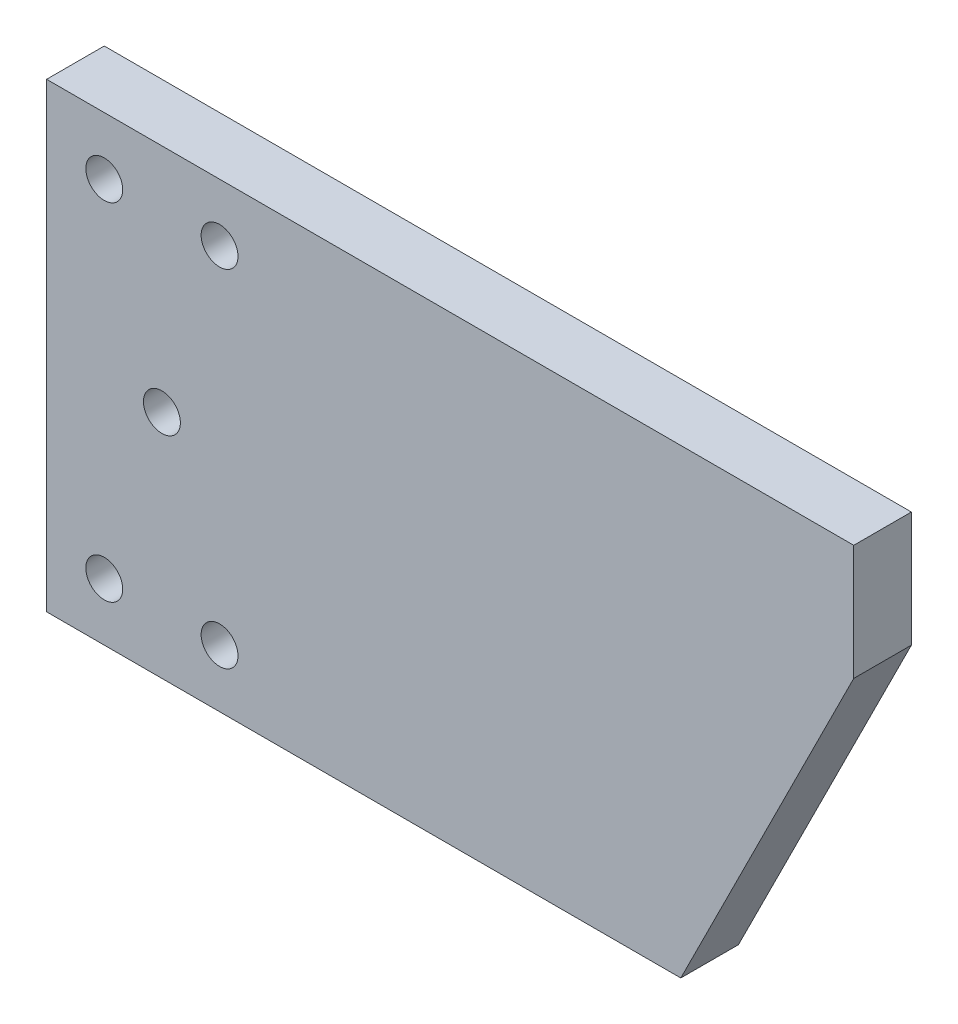
ISO-10303-21;
HEADER;
FILE_DESCRIPTION(('STEP AP214'),'2;1');
FILE_NAME('part.step','',(''),(''),'','','');
FILE_SCHEMA(('AUTOMOTIVE_DESIGN { 1 0 10303 214 1 1 1 1 }'));
ENDSEC;
DATA;
#1=APPLICATION_CONTEXT('core data for automotive mechanical design processes');
#2=APPLICATION_PROTOCOL_DEFINITION('international standard','automotive_design',2000,#1);
#3=PRODUCT_CONTEXT('',#1,'mechanical');
#4=PRODUCT('Part','Part','',(#3));
#5=PRODUCT_RELATED_PRODUCT_CATEGORY('part','',(#4));
#6=PRODUCT_DEFINITION_FORMATION('','',#4);
#7=PRODUCT_DEFINITION_CONTEXT('part definition',#1,'design');
#8=PRODUCT_DEFINITION('design','',#6,#7);
#9=PRODUCT_DEFINITION_SHAPE('','',#8);
#10=(LENGTH_UNIT() NAMED_UNIT(*) SI_UNIT(.MILLI.,.METRE.));
#11=(NAMED_UNIT(*) PLANE_ANGLE_UNIT() SI_UNIT($,.RADIAN.));
#12=(NAMED_UNIT(*) SI_UNIT($,.STERADIAN.) SOLID_ANGLE_UNIT());
#13=UNCERTAINTY_MEASURE_WITH_UNIT(LENGTH_MEASURE(1.E-05),#10,'distance_accuracy_value','');
#14=(GEOMETRIC_REPRESENTATION_CONTEXT(3) GLOBAL_UNCERTAINTY_ASSIGNED_CONTEXT((#13)) GLOBAL_UNIT_ASSIGNED_CONTEXT((#10,
#11,#12)) REPRESENTATION_CONTEXT('',''));
#15=CARTESIAN_POINT('',(0.,0.,0.));
#16=DIRECTION('',(0.,0.,1.));
#17=DIRECTION('',(1.,0.,0.));
#18=AXIS2_PLACEMENT_3D('',#15,#16,#17);
#19=CARTESIAN_POINT('',(0.,0.,6.35));
#20=DIRECTION('',(0.,0.,-1.));
#21=DIRECTION('',(-1.,0.,0.));
#22=AXIS2_PLACEMENT_3D('',#19,#20,#21);
#23=PLANE('',#22);
#24=DIRECTION('',(0.,-1.,0.));
#25=VECTOR('',#24,1.);
#26=CARTESIAN_POINT('',(0.,0.,6.35));
#27=LINE('',#26,#25);
#28=CARTESIAN_POINT('',(0.,50.8,6.35));
#29=VERTEX_POINT('',#28);
#30=CARTESIAN_POINT('',(0.,0.,6.35));
#31=VERTEX_POINT('',#30);
#32=EDGE_CURVE('E119',#29,#31,#27,.T.);
#33=ORIENTED_EDGE('',*,*,#32,.T.);
#34=DIRECTION('',(1.,0.,0.));
#35=VECTOR('',#34,1.);
#36=CARTESIAN_POINT('',(0.,0.,6.35));
#37=LINE('',#36,#35);
#38=CARTESIAN_POINT('',(69.85,0.,6.35));
#39=VERTEX_POINT('',#38);
#40=EDGE_CURVE('E86',#31,#39,#37,.T.);
#41=ORIENTED_EDGE('',*,*,#40,.T.);
#42=DIRECTION('',(0.447213595499958,0.894427190999916,0.));
#43=VECTOR('',#42,1.);
#44=CARTESIAN_POINT('',(69.85,0.,6.35));
#45=LINE('',#44,#43);
#46=CARTESIAN_POINT('',(88.9,38.1,6.35));
#47=VERTEX_POINT('',#46);
#48=EDGE_CURVE('E90',#39,#47,#45,.T.);
#49=ORIENTED_EDGE('',*,*,#48,.T.);
#50=DIRECTION('',(0.,1.,0.));
#51=VECTOR('',#50,1.);
#52=CARTESIAN_POINT('',(88.9,38.1,6.35));
#53=LINE('',#52,#51);
#54=CARTESIAN_POINT('',(88.9,50.8,6.35));
#55=VERTEX_POINT('',#54);
#56=EDGE_CURVE('E94',#47,#55,#53,.T.);
#57=ORIENTED_EDGE('',*,*,#56,.T.);
#58=DIRECTION('',(-1.,0.,0.));
#59=VECTOR('',#58,1.);
#60=CARTESIAN_POINT('',(0.,50.8,6.35));
#61=LINE('',#60,#59);
#62=EDGE_CURVE('E52',#55,#29,#61,.T.);
#63=ORIENTED_EDGE('',*,*,#62,.T.);
#64=EDGE_LOOP('',(#33,#41,#49,#57,#63));
#65=FACE_BOUND('',#64,.T.);
#66=CARTESIAN_POINT('',(6.35,6.35,6.35));
#67=DIRECTION('',(0.,0.,1.));
#68=DIRECTION('',(1.,0.,0.));
#69=AXIS2_PLACEMENT_3D('',#66,#67,#68);
#70=CIRCLE('',#69,2.032);
#71=CARTESIAN_POINT('',(8.382,6.35,6.35));
#72=VERTEX_POINT('',#71);
#73=EDGE_CURVE('E114',#72,#72,#70,.T.);
#74=ORIENTED_EDGE('',*,*,#73,.F.);
#75=EDGE_LOOP('',(#74));
#76=FACE_BOUND('',#75,.T.);
#77=CARTESIAN_POINT('',(12.7,25.4,6.35));
#78=DIRECTION('',(0.,0.,1.));
#79=DIRECTION('',(1.,0.,0.));
#80=AXIS2_PLACEMENT_3D('',#77,#78,#79);
#81=CIRCLE('',#80,2.032);
#82=CARTESIAN_POINT('',(14.732,25.4,6.35));
#83=VERTEX_POINT('',#82);
#84=EDGE_CURVE('E188',#83,#83,#81,.T.);
#85=ORIENTED_EDGE('',*,*,#84,.F.);
#86=EDGE_LOOP('',(#85));
#87=FACE_BOUND('',#86,.T.);
#88=CARTESIAN_POINT('',(19.05,6.35,6.35));
#89=DIRECTION('',(0.,0.,1.));
#90=DIRECTION('',(1.,0.,0.));
#91=AXIS2_PLACEMENT_3D('',#88,#89,#90);
#92=CIRCLE('',#91,2.032);
#93=CARTESIAN_POINT('',(21.082,6.35,6.35));
#94=VERTEX_POINT('',#93);
#95=EDGE_CURVE('E182',#94,#94,#92,.T.);
#96=ORIENTED_EDGE('',*,*,#95,.F.);
#97=EDGE_LOOP('',(#96));
#98=FACE_BOUND('',#97,.T.);
#99=CARTESIAN_POINT('',(19.0499999999999,44.45,6.35));
#100=DIRECTION('',(0.,0.,1.));
#101=DIRECTION('',(1.,0.,0.));
#102=AXIS2_PLACEMENT_3D('',#99,#100,#101);
#103=CIRCLE('',#102,2.032);
#104=CARTESIAN_POINT('',(21.0819999999999,44.45,6.35));
#105=VERTEX_POINT('',#104);
#106=EDGE_CURVE('E176',#105,#105,#103,.T.);
#107=ORIENTED_EDGE('',*,*,#106,.F.);
#108=EDGE_LOOP('',(#107));
#109=FACE_BOUND('',#108,.T.);
#110=CARTESIAN_POINT('',(6.34999999999987,44.45,6.35));
#111=DIRECTION('',(0.,0.,1.));
#112=DIRECTION('',(1.,0.,0.));
#113=AXIS2_PLACEMENT_3D('',#110,#111,#112);
#114=CIRCLE('',#113,2.032);
#115=CARTESIAN_POINT('',(8.38199999999987,44.45,6.35));
#116=VERTEX_POINT('',#115);
#117=EDGE_CURVE('E167',#116,#116,#114,.T.);
#118=ORIENTED_EDGE('',*,*,#117,.F.);
#119=EDGE_LOOP('',(#118));
#120=FACE_BOUND('',#119,.T.);
#121=ADVANCED_FACE('F35',(#65,#76,#87,#98,#109,#120),#23,.F.);
#122=CARTESIAN_POINT('',(0.,0.,0.));
#123=DIRECTION('',(0.,0.,-1.));
#124=DIRECTION('',(-1.,0.,0.));
#125=AXIS2_PLACEMENT_3D('',#122,#123,#124);
#126=PLANE('',#125);
#127=CARTESIAN_POINT('',(19.0499999999999,44.45,0.));
#128=DIRECTION('',(0.,0.,1.));
#129=DIRECTION('',(1.,0.,0.));
#130=AXIS2_PLACEMENT_3D('',#127,#128,#129);
#131=CIRCLE('',#130,2.032);
#132=CARTESIAN_POINT('',(21.0819999999999,44.45,0.));
#133=VERTEX_POINT('',#132);
#134=EDGE_CURVE('E173',#133,#133,#131,.T.);
#135=ORIENTED_EDGE('',*,*,#134,.T.);
#136=EDGE_LOOP('',(#135));
#137=FACE_BOUND('',#136,.T.);
#138=CARTESIAN_POINT('',(12.7,25.4,0.));
#139=DIRECTION('',(0.,0.,1.));
#140=DIRECTION('',(1.,0.,0.));
#141=AXIS2_PLACEMENT_3D('',#138,#139,#140);
#142=CIRCLE('',#141,2.032);
#143=CARTESIAN_POINT('',(14.732,25.4,0.));
#144=VERTEX_POINT('',#143);
#145=EDGE_CURVE('E185',#144,#144,#142,.T.);
#146=ORIENTED_EDGE('',*,*,#145,.T.);
#147=EDGE_LOOP('',(#146));
#148=FACE_BOUND('',#147,.T.);
#149=DIRECTION('',(0.,-1.,0.));
#150=VECTOR('',#149,1.);
#151=CARTESIAN_POINT('',(0.,0.,0.));
#152=LINE('',#151,#150);
#153=CARTESIAN_POINT('',(0.,50.8,0.));
#154=VERTEX_POINT('',#153);
#155=CARTESIAN_POINT('',(0.,0.,0.));
#156=VERTEX_POINT('',#155);
#157=EDGE_CURVE('E110',#154,#156,#152,.T.);
#158=ORIENTED_EDGE('',*,*,#157,.F.);
#159=DIRECTION('',(-1.,0.,0.));
#160=VECTOR('',#159,1.);
#161=CARTESIAN_POINT('',(0.,50.8,0.));
#162=LINE('',#161,#160);
#163=CARTESIAN_POINT('',(88.9,50.8,0.));
#164=VERTEX_POINT('',#163);
#165=EDGE_CURVE('E78',#164,#154,#162,.T.);
#166=ORIENTED_EDGE('',*,*,#165,.F.);
#167=DIRECTION('',(0.,1.,0.));
#168=VECTOR('',#167,1.);
#169=CARTESIAN_POINT('',(88.9,38.1,0.));
#170=LINE('',#169,#168);
#171=CARTESIAN_POINT('',(88.9,38.1,0.));
#172=VERTEX_POINT('',#171);
#173=EDGE_CURVE('E72',#172,#164,#170,.T.);
#174=ORIENTED_EDGE('',*,*,#173,.F.);
#175=DIRECTION('',(0.447213595499958,0.894427190999916,0.));
#176=VECTOR('',#175,1.);
#177=CARTESIAN_POINT('',(69.85,0.,0.));
#178=LINE('',#177,#176);
#179=CARTESIAN_POINT('',(69.85,0.,0.));
#180=VERTEX_POINT('',#179);
#181=EDGE_CURVE('E101',#180,#172,#178,.T.);
#182=ORIENTED_EDGE('',*,*,#181,.F.);
#183=DIRECTION('',(1.,0.,0.));
#184=VECTOR('',#183,1.);
#185=CARTESIAN_POINT('',(0.,0.,0.));
#186=LINE('',#185,#184);
#187=EDGE_CURVE('E113',#156,#180,#186,.T.);
#188=ORIENTED_EDGE('',*,*,#187,.F.);
#189=EDGE_LOOP('',(#158,#166,#174,#182,#188));
#190=FACE_BOUND('',#189,.T.);
#191=CARTESIAN_POINT('',(6.35,6.35,0.));
#192=DIRECTION('',(0.,0.,1.));
#193=DIRECTION('',(1.,0.,0.));
#194=AXIS2_PLACEMENT_3D('',#191,#192,#193);
#195=CIRCLE('',#194,2.032);
#196=CARTESIAN_POINT('',(8.382,6.35,0.));
#197=VERTEX_POINT('',#196);
#198=EDGE_CURVE('E191',#197,#197,#195,.T.);
#199=ORIENTED_EDGE('',*,*,#198,.T.);
#200=EDGE_LOOP('',(#199));
#201=FACE_BOUND('',#200,.T.);
#202=CARTESIAN_POINT('',(19.05,6.35,0.));
#203=DIRECTION('',(0.,0.,1.));
#204=DIRECTION('',(1.,0.,0.));
#205=AXIS2_PLACEMENT_3D('',#202,#203,#204);
#206=CIRCLE('',#205,2.032);
#207=CARTESIAN_POINT('',(21.082,6.35,0.));
#208=VERTEX_POINT('',#207);
#209=EDGE_CURVE('E179',#208,#208,#206,.T.);
#210=ORIENTED_EDGE('',*,*,#209,.T.);
#211=EDGE_LOOP('',(#210));
#212=FACE_BOUND('',#211,.T.);
#213=CARTESIAN_POINT('',(6.34999999999987,44.45,0.));
#214=DIRECTION('',(0.,0.,1.));
#215=DIRECTION('',(1.,0.,0.));
#216=AXIS2_PLACEMENT_3D('',#213,#214,#215);
#217=CIRCLE('',#216,2.032);
#218=CARTESIAN_POINT('',(8.38199999999987,44.45,0.));
#219=VERTEX_POINT('',#218);
#220=EDGE_CURVE('E170',#219,#219,#217,.T.);
#221=ORIENTED_EDGE('',*,*,#220,.T.);
#222=EDGE_LOOP('',(#221));
#223=FACE_BOUND('',#222,.T.);
#224=ADVANCED_FACE('F123',(#137,#148,#190,#201,#212,#223),#126,.T.);
#225=CARTESIAN_POINT('',(0.,0.,6.35));
#226=DIRECTION('',(1.,0.,0.));
#227=DIRECTION('',(0.,0.,-1.));
#228=AXIS2_PLACEMENT_3D('',#225,#226,#227);
#229=PLANE('',#228);
#230=ORIENTED_EDGE('',*,*,#157,.T.);
#231=DIRECTION('',(0.,0.,-1.));
#232=VECTOR('',#231,1.);
#233=CARTESIAN_POINT('',(0.,0.,6.35));
#234=LINE('',#233,#232);
#235=EDGE_CURVE('E11',#31,#156,#234,.T.);
#236=ORIENTED_EDGE('',*,*,#235,.F.);
#237=ORIENTED_EDGE('',*,*,#32,.F.);
#238=DIRECTION('',(0.,0.,-1.));
#239=VECTOR('',#238,1.);
#240=CARTESIAN_POINT('',(0.,50.8,6.35));
#241=LINE('',#240,#239);
#242=EDGE_CURVE('E106',#29,#154,#241,.T.);
#243=ORIENTED_EDGE('',*,*,#242,.T.);
#244=EDGE_LOOP('',(#230,#236,#237,#243));
#245=FACE_BOUND('',#244,.T.);
#246=ADVANCED_FACE('F37',(#245),#229,.F.);
#247=CARTESIAN_POINT('',(0.,0.,6.35));
#248=DIRECTION('',(0.,1.,0.));
#249=DIRECTION('',(0.,0.,1.));
#250=AXIS2_PLACEMENT_3D('',#247,#248,#249);
#251=PLANE('',#250);
#252=ORIENTED_EDGE('',*,*,#187,.T.);
#253=DIRECTION('',(0.,0.,-1.));
#254=VECTOR('',#253,1.);
#255=CARTESIAN_POINT('',(69.85,0.,6.35));
#256=LINE('',#255,#254);
#257=EDGE_CURVE('E44',#39,#180,#256,.T.);
#258=ORIENTED_EDGE('',*,*,#257,.F.);
#259=ORIENTED_EDGE('',*,*,#40,.F.);
#260=ORIENTED_EDGE('',*,*,#235,.T.);
#261=EDGE_LOOP('',(#252,#258,#259,#260));
#262=FACE_BOUND('',#261,.T.);
#263=ADVANCED_FACE('F251',(#262),#251,.F.);
#264=CARTESIAN_POINT('',(69.85,0.,6.35));
#265=DIRECTION('',(-0.894427190999916,0.447213595499958,0.));
#266=DIRECTION('',(-0.447213595499958,-0.894427190999916,0.));
#267=AXIS2_PLACEMENT_3D('',#264,#265,#266);
#268=PLANE('',#267);
#269=ORIENTED_EDGE('',*,*,#181,.T.);
#270=DIRECTION('',(0.,0.,-1.));
#271=VECTOR('',#270,1.);
#272=CARTESIAN_POINT('',(88.9,38.1,6.35));
#273=LINE('',#272,#271);
#274=EDGE_CURVE('E98',#47,#172,#273,.T.);
#275=ORIENTED_EDGE('',*,*,#274,.F.);
#276=ORIENTED_EDGE('',*,*,#48,.F.);
#277=ORIENTED_EDGE('',*,*,#257,.T.);
#278=EDGE_LOOP('',(#269,#275,#276,#277));
#279=FACE_BOUND('',#278,.T.);
#280=ADVANCED_FACE('F99',(#279),#268,.F.);
#281=CARTESIAN_POINT('',(88.9,38.1,6.35));
#282=DIRECTION('',(-1.,0.,0.));
#283=DIRECTION('',(0.,0.,1.));
#284=AXIS2_PLACEMENT_3D('',#281,#282,#283);
#285=PLANE('',#284);
#286=ORIENTED_EDGE('',*,*,#173,.T.);
#287=DIRECTION('',(0.,0.,-1.));
#288=VECTOR('',#287,1.);
#289=CARTESIAN_POINT('',(88.9,50.8,6.35));
#290=LINE('',#289,#288);
#291=EDGE_CURVE('E102',#55,#164,#290,.T.);
#292=ORIENTED_EDGE('',*,*,#291,.F.);
#293=ORIENTED_EDGE('',*,*,#56,.F.);
#294=ORIENTED_EDGE('',*,*,#274,.T.);
#295=EDGE_LOOP('',(#286,#292,#293,#294));
#296=FACE_BOUND('',#295,.T.);
#297=ADVANCED_FACE('F104',(#296),#285,.F.);
#298=CARTESIAN_POINT('',(0.,50.8,6.35));
#299=DIRECTION('',(0.,-1.,0.));
#300=DIRECTION('',(0.,0.,-1.));
#301=AXIS2_PLACEMENT_3D('',#298,#299,#300);
#302=PLANE('',#301);
#303=ORIENTED_EDGE('',*,*,#165,.T.);
#304=ORIENTED_EDGE('',*,*,#242,.F.);
#305=ORIENTED_EDGE('',*,*,#62,.F.);
#306=ORIENTED_EDGE('',*,*,#291,.T.);
#307=EDGE_LOOP('',(#303,#304,#305,#306));
#308=FACE_BOUND('',#307,.T.);
#309=ADVANCED_FACE('F128',(#308),#302,.F.);
#310=CARTESIAN_POINT('',(6.35,6.35,6.35));
#311=DIRECTION('',(0.,0.,-1.));
#312=DIRECTION('',(-1.,0.,0.));
#313=AXIS2_PLACEMENT_3D('',#310,#311,#312);
#314=CYLINDRICAL_SURFACE('',#313,2.032);
#315=ORIENTED_EDGE('',*,*,#73,.T.);
#316=EDGE_LOOP('',(#315));
#317=FACE_BOUND('',#316,.T.);
#318=ORIENTED_EDGE('',*,*,#198,.F.);
#319=EDGE_LOOP('',(#318));
#320=FACE_BOUND('',#319,.T.);
#321=ADVANCED_FACE('F130',(#317,#320),#314,.F.);
#322=CARTESIAN_POINT('',(12.7,25.4,6.35));
#323=DIRECTION('',(0.,0.,-1.));
#324=DIRECTION('',(-1.,0.,0.));
#325=AXIS2_PLACEMENT_3D('',#322,#323,#324);
#326=CYLINDRICAL_SURFACE('',#325,2.032);
#327=ORIENTED_EDGE('',*,*,#84,.T.);
#328=EDGE_LOOP('',(#327));
#329=FACE_BOUND('',#328,.T.);
#330=ORIENTED_EDGE('',*,*,#145,.F.);
#331=EDGE_LOOP('',(#330));
#332=FACE_BOUND('',#331,.T.);
#333=ADVANCED_FACE('F136',(#329,#332),#326,.F.);
#334=CARTESIAN_POINT('',(19.05,6.35,6.35));
#335=DIRECTION('',(0.,0.,-1.));
#336=DIRECTION('',(-1.,0.,0.));
#337=AXIS2_PLACEMENT_3D('',#334,#335,#336);
#338=CYLINDRICAL_SURFACE('',#337,2.032);
#339=ORIENTED_EDGE('',*,*,#95,.T.);
#340=EDGE_LOOP('',(#339));
#341=FACE_BOUND('',#340,.T.);
#342=ORIENTED_EDGE('',*,*,#209,.F.);
#343=EDGE_LOOP('',(#342));
#344=FACE_BOUND('',#343,.T.);
#345=ADVANCED_FACE('F150',(#341,#344),#338,.F.);
#346=CARTESIAN_POINT('',(19.0499999999999,44.45,6.35));
#347=DIRECTION('',(0.,0.,-1.));
#348=DIRECTION('',(-1.,0.,0.));
#349=AXIS2_PLACEMENT_3D('',#346,#347,#348);
#350=CYLINDRICAL_SURFACE('',#349,2.032);
#351=ORIENTED_EDGE('',*,*,#106,.T.);
#352=EDGE_LOOP('',(#351));
#353=FACE_BOUND('',#352,.T.);
#354=ORIENTED_EDGE('',*,*,#134,.F.);
#355=EDGE_LOOP('',(#354));
#356=FACE_BOUND('',#355,.T.);
#357=ADVANCED_FACE('F154',(#353,#356),#350,.F.);
#358=CARTESIAN_POINT('',(6.34999999999987,44.45,6.35));
#359=DIRECTION('',(0.,0.,-1.));
#360=DIRECTION('',(-1.,0.,0.));
#361=AXIS2_PLACEMENT_3D('',#358,#359,#360);
#362=CYLINDRICAL_SURFACE('',#361,2.032);
#363=ORIENTED_EDGE('',*,*,#117,.T.);
#364=EDGE_LOOP('',(#363));
#365=FACE_BOUND('',#364,.T.);
#366=ORIENTED_EDGE('',*,*,#220,.F.);
#367=EDGE_LOOP('',(#366));
#368=FACE_BOUND('',#367,.T.);
#369=ADVANCED_FACE('F158',(#365,#368),#362,.F.);
#370=CLOSED_SHELL('',(#121,#224,#246,#263,#280,#297,#309,#321,#333,#345,#357,#369));
#371=MANIFOLD_SOLID_BREP('B2',#370);
#372=ADVANCED_BREP_SHAPE_REPRESENTATION('',(#18,#371),#14);
#373=SHAPE_DEFINITION_REPRESENTATION(#9,#372);
ENDSEC;
END-ISO-10303-21;
